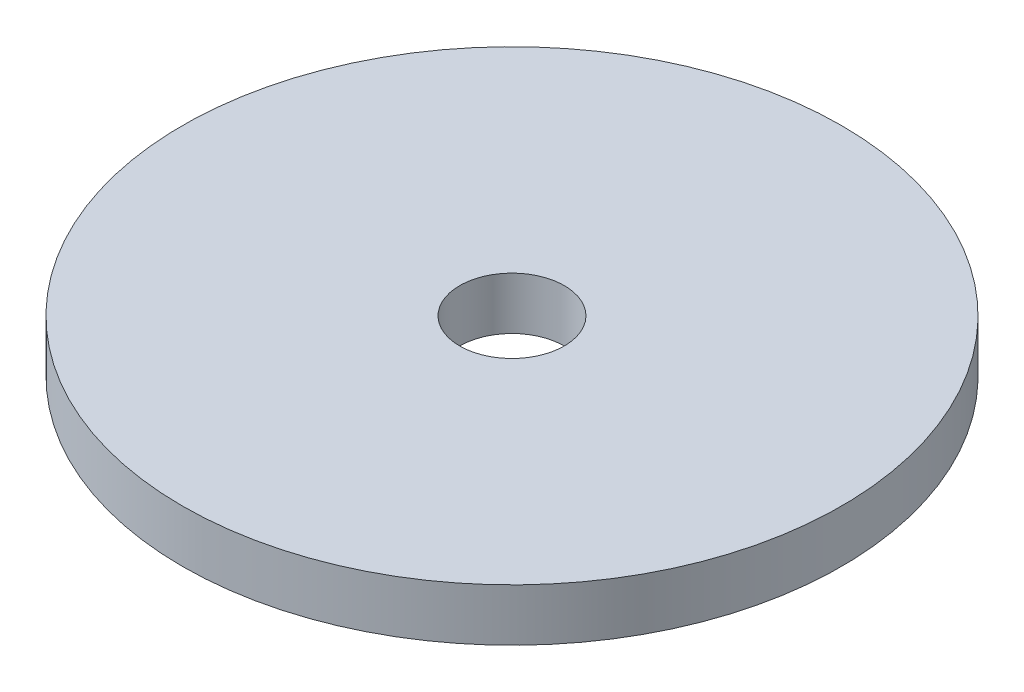
ISO-10303-21;
HEADER;
FILE_DESCRIPTION(('STEP AP214'),'2;1');
FILE_NAME('part.step','',(''),(''),'','','');
FILE_SCHEMA(('AUTOMOTIVE_DESIGN { 1 0 10303 214 1 1 1 1 }'));
ENDSEC;
DATA;
#1=APPLICATION_CONTEXT('core data for automotive mechanical design processes');
#2=APPLICATION_PROTOCOL_DEFINITION('international standard','automotive_design',2000,#1);
#3=PRODUCT_CONTEXT('',#1,'mechanical');
#4=PRODUCT('Part','Part','',(#3));
#5=PRODUCT_RELATED_PRODUCT_CATEGORY('part','',(#4));
#6=PRODUCT_DEFINITION_FORMATION('','',#4);
#7=PRODUCT_DEFINITION_CONTEXT('part definition',#1,'design');
#8=PRODUCT_DEFINITION('design','',#6,#7);
#9=PRODUCT_DEFINITION_SHAPE('','',#8);
#10=(LENGTH_UNIT() NAMED_UNIT(*) SI_UNIT(.MILLI.,.METRE.));
#11=(NAMED_UNIT(*) PLANE_ANGLE_UNIT() SI_UNIT($,.RADIAN.));
#12=(NAMED_UNIT(*) SI_UNIT($,.STERADIAN.) SOLID_ANGLE_UNIT());
#13=UNCERTAINTY_MEASURE_WITH_UNIT(LENGTH_MEASURE(1.E-05),#10,'distance_accuracy_value','');
#14=(GEOMETRIC_REPRESENTATION_CONTEXT(3) GLOBAL_UNCERTAINTY_ASSIGNED_CONTEXT((#13)) GLOBAL_UNIT_ASSIGNED_CONTEXT((#10,
#11,#12)) REPRESENTATION_CONTEXT('',''));
#15=CARTESIAN_POINT('',(0.,0.,0.));
#16=DIRECTION('',(0.,0.,1.));
#17=DIRECTION('',(1.,0.,0.));
#18=AXIS2_PLACEMENT_3D('',#15,#16,#17);
#19=CARTESIAN_POINT('',(0.,3.175,0.));
#20=DIRECTION('',(0.,1.,0.));
#21=DIRECTION('',(0.,0.,1.));
#22=AXIS2_PLACEMENT_3D('',#19,#20,#21);
#23=PLANE('',#22);
#24=CARTESIAN_POINT('',(0.,3.175,0.));
#25=DIRECTION('',(0.,1.,0.));
#26=DIRECTION('',(0.,0.,1.));
#27=AXIS2_PLACEMENT_3D('',#24,#25,#26);
#28=CIRCLE('',#27,20.);
#29=CARTESIAN_POINT('',(0.,3.175,20.));
#30=VERTEX_POINT('',#29);
#31=EDGE_CURVE('E10',#30,#30,#28,.T.);
#32=ORIENTED_EDGE('',*,*,#31,.T.);
#33=EDGE_LOOP('',(#32));
#34=FACE_BOUND('',#33,.T.);
#35=CARTESIAN_POINT('',(0.,3.175,0.));
#36=DIRECTION('',(0.,1.,0.));
#37=DIRECTION('',(0.,0.,1.));
#38=AXIS2_PLACEMENT_3D('',#35,#36,#37);
#39=CIRCLE('',#38,3.175);
#40=CARTESIAN_POINT('',(0.,3.175,3.175));
#41=VERTEX_POINT('',#40);
#42=EDGE_CURVE('E42',#41,#41,#39,.T.);
#43=ORIENTED_EDGE('',*,*,#42,.F.);
#44=EDGE_LOOP('',(#43));
#45=FACE_BOUND('',#44,.T.);
#46=ADVANCED_FACE('F31',(#34,#45),#23,.T.);
#47=CARTESIAN_POINT('',(0.,0.,0.));
#48=DIRECTION('',(0.,1.,0.));
#49=DIRECTION('',(0.,0.,1.));
#50=AXIS2_PLACEMENT_3D('',#47,#48,#49);
#51=PLANE('',#50);
#52=CARTESIAN_POINT('',(0.,0.,0.));
#53=DIRECTION('',(0.,1.,0.));
#54=DIRECTION('',(0.,0.,1.));
#55=AXIS2_PLACEMENT_3D('',#52,#53,#54);
#56=CIRCLE('',#55,20.);
#57=CARTESIAN_POINT('',(0.,0.,20.));
#58=VERTEX_POINT('',#57);
#59=EDGE_CURVE('E35',#58,#58,#56,.T.);
#60=ORIENTED_EDGE('',*,*,#59,.F.);
#61=EDGE_LOOP('',(#60));
#62=FACE_BOUND('',#61,.T.);
#63=CARTESIAN_POINT('',(0.,0.,0.));
#64=DIRECTION('',(0.,1.,0.));
#65=DIRECTION('',(0.,0.,1.));
#66=AXIS2_PLACEMENT_3D('',#63,#64,#65);
#67=CIRCLE('',#66,3.175);
#68=CARTESIAN_POINT('',(0.,0.,3.175));
#69=VERTEX_POINT('',#68);
#70=EDGE_CURVE('E44',#69,#69,#67,.T.);
#71=ORIENTED_EDGE('',*,*,#70,.T.);
#72=EDGE_LOOP('',(#71));
#73=FACE_BOUND('',#72,.T.);
#74=ADVANCED_FACE('F54',(#62,#73),#51,.F.);
#75=CARTESIAN_POINT('',(0.,3.175,0.));
#76=DIRECTION('',(0.,-1.,0.));
#77=DIRECTION('',(0.,0.,-1.));
#78=AXIS2_PLACEMENT_3D('',#75,#76,#77);
#79=CYLINDRICAL_SURFACE('',#78,20.);
#80=ORIENTED_EDGE('',*,*,#31,.F.);
#81=EDGE_LOOP('',(#80));
#82=FACE_BOUND('',#81,.T.);
#83=ORIENTED_EDGE('',*,*,#59,.T.);
#84=EDGE_LOOP('',(#83));
#85=FACE_BOUND('',#84,.T.);
#86=ADVANCED_FACE('F33',(#82,#85),#79,.T.);
#87=CARTESIAN_POINT('',(0.,3.175,0.));
#88=DIRECTION('',(0.,-1.,0.));
#89=DIRECTION('',(0.,0.,-1.));
#90=AXIS2_PLACEMENT_3D('',#87,#88,#89);
#91=CYLINDRICAL_SURFACE('',#90,3.175);
#92=ORIENTED_EDGE('',*,*,#42,.T.);
#93=EDGE_LOOP('',(#92));
#94=FACE_BOUND('',#93,.T.);
#95=ORIENTED_EDGE('',*,*,#70,.F.);
#96=EDGE_LOOP('',(#95));
#97=FACE_BOUND('',#96,.T.);
#98=ADVANCED_FACE('F50',(#94,#97),#91,.F.);
#99=CLOSED_SHELL('',(#46,#74,#86,#98));
#100=MANIFOLD_SOLID_BREP('B2',#99);
#101=ADVANCED_BREP_SHAPE_REPRESENTATION('',(#18,#100),#14);
#102=SHAPE_DEFINITION_REPRESENTATION(#9,#101);
ENDSEC;
END-ISO-10303-21;
